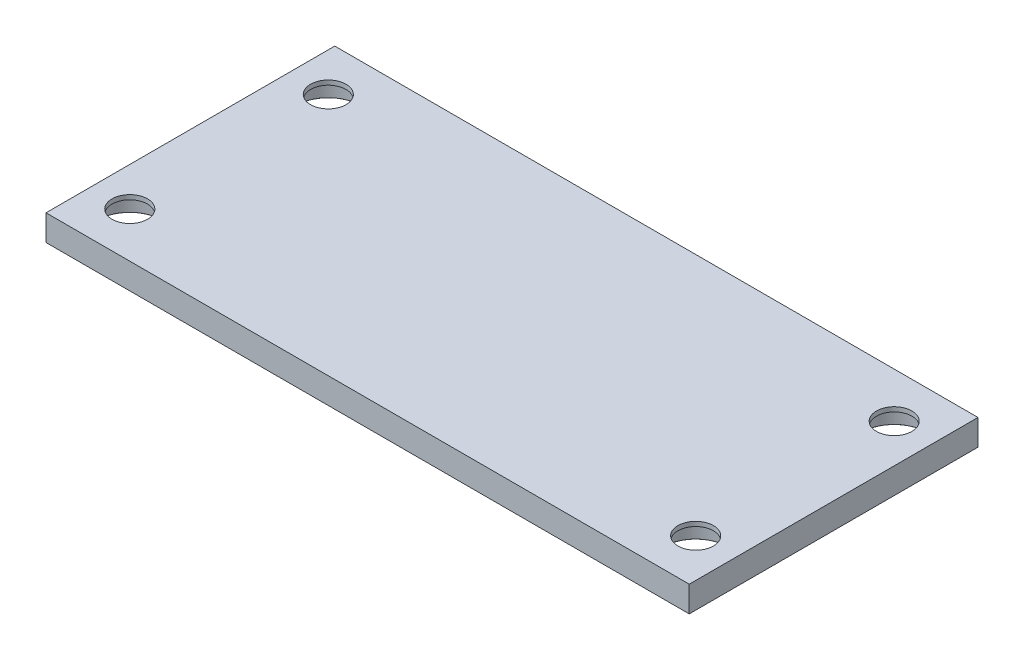
ISO-10303-21;
HEADER;
FILE_DESCRIPTION(('STEP AP214'),'2;1');
FILE_NAME('part.step','',(''),(''),'','','');
FILE_SCHEMA(('AUTOMOTIVE_DESIGN { 1 0 10303 214 1 1 1 1 }'));
ENDSEC;
DATA;
#1=APPLICATION_CONTEXT('core data for automotive mechanical design processes');
#2=APPLICATION_PROTOCOL_DEFINITION('international standard','automotive_design',2000,#1);
#3=PRODUCT_CONTEXT('',#1,'mechanical');
#4=PRODUCT('Part','Part','',(#3));
#5=PRODUCT_RELATED_PRODUCT_CATEGORY('part','',(#4));
#6=PRODUCT_DEFINITION_FORMATION('','',#4);
#7=PRODUCT_DEFINITION_CONTEXT('part definition',#1,'design');
#8=PRODUCT_DEFINITION('design','',#6,#7);
#9=PRODUCT_DEFINITION_SHAPE('','',#8);
#10=(LENGTH_UNIT() NAMED_UNIT(*) SI_UNIT(.MILLI.,.METRE.));
#11=(NAMED_UNIT(*) PLANE_ANGLE_UNIT() SI_UNIT($,.RADIAN.));
#12=(NAMED_UNIT(*) SI_UNIT($,.STERADIAN.) SOLID_ANGLE_UNIT());
#13=UNCERTAINTY_MEASURE_WITH_UNIT(LENGTH_MEASURE(1.E-05),#10,'distance_accuracy_value','');
#14=(GEOMETRIC_REPRESENTATION_CONTEXT(3) GLOBAL_UNCERTAINTY_ASSIGNED_CONTEXT((#13)) GLOBAL_UNIT_ASSIGNED_CONTEXT((#10,
#11,#12)) REPRESENTATION_CONTEXT('',''));
#15=CARTESIAN_POINT('',(0.,0.,0.));
#16=DIRECTION('',(0.,0.,1.));
#17=DIRECTION('',(1.,0.,0.));
#18=AXIS2_PLACEMENT_3D('',#15,#16,#17);
#19=CARTESIAN_POINT('',(-49.9,4.,-22.4));
#20=DIRECTION('',(1.,0.,0.));
#21=DIRECTION('',(0.,0.,-1.));
#22=AXIS2_PLACEMENT_3D('',#19,#20,#21);
#23=PLANE('',#22);
#24=DIRECTION('',(0.,0.,1.));
#25=VECTOR('',#24,1.);
#26=CARTESIAN_POINT('',(-49.9,0.,-22.4));
#27=LINE('',#26,#25);
#28=CARTESIAN_POINT('',(-49.9,0.,-22.4));
#29=VERTEX_POINT('',#28);
#30=CARTESIAN_POINT('',(-49.9,0.,22.4));
#31=VERTEX_POINT('',#30);
#32=EDGE_CURVE('E104',#29,#31,#27,.T.);
#33=ORIENTED_EDGE('',*,*,#32,.T.);
#34=DIRECTION('',(0.,-1.,0.));
#35=VECTOR('',#34,1.);
#36=CARTESIAN_POINT('',(-49.9,4.,22.4));
#37=LINE('',#36,#35);
#38=CARTESIAN_POINT('',(-49.9,4.,22.4));
#39=VERTEX_POINT('',#38);
#40=EDGE_CURVE('E11',#39,#31,#37,.T.);
#41=ORIENTED_EDGE('',*,*,#40,.F.);
#42=DIRECTION('',(0.,0.,1.));
#43=VECTOR('',#42,1.);
#44=CARTESIAN_POINT('',(-49.9,4.,-22.4));
#45=LINE('',#44,#43);
#46=CARTESIAN_POINT('',(-49.9,4.,-22.4));
#47=VERTEX_POINT('',#46);
#48=EDGE_CURVE('E91',#47,#39,#45,.T.);
#49=ORIENTED_EDGE('',*,*,#48,.F.);
#50=DIRECTION('',(0.,-1.,0.));
#51=VECTOR('',#50,1.);
#52=CARTESIAN_POINT('',(-49.9,4.,-22.4));
#53=LINE('',#52,#51);
#54=EDGE_CURVE('E100',#47,#29,#53,.T.);
#55=ORIENTED_EDGE('',*,*,#54,.T.);
#56=EDGE_LOOP('',(#33,#41,#49,#55));
#57=FACE_BOUND('',#56,.T.);
#58=ADVANCED_FACE('F38',(#57),#23,.F.);
#59=CARTESIAN_POINT('',(49.9,4.,22.4));
#60=DIRECTION('',(0.,0.,-1.));
#61=DIRECTION('',(-1.,0.,0.));
#62=AXIS2_PLACEMENT_3D('',#59,#60,#61);
#63=PLANE('',#62);
#64=DIRECTION('',(1.,0.,0.));
#65=VECTOR('',#64,1.);
#66=CARTESIAN_POINT('',(49.9,0.,22.4));
#67=LINE('',#66,#65);
#68=CARTESIAN_POINT('',(49.9,0.,22.4));
#69=VERTEX_POINT('',#68);
#70=EDGE_CURVE('E95',#31,#69,#67,.T.);
#71=ORIENTED_EDGE('',*,*,#70,.T.);
#72=DIRECTION('',(0.,-1.,0.));
#73=VECTOR('',#72,1.);
#74=CARTESIAN_POINT('',(49.9,4.,22.4));
#75=LINE('',#74,#73);
#76=CARTESIAN_POINT('',(49.9,4.,22.4));
#77=VERTEX_POINT('',#76);
#78=EDGE_CURVE('E47',#77,#69,#75,.T.);
#79=ORIENTED_EDGE('',*,*,#78,.F.);
#80=DIRECTION('',(1.,0.,0.));
#81=VECTOR('',#80,1.);
#82=CARTESIAN_POINT('',(49.9,4.,22.4));
#83=LINE('',#82,#81);
#84=EDGE_CURVE('E86',#39,#77,#83,.T.);
#85=ORIENTED_EDGE('',*,*,#84,.F.);
#86=ORIENTED_EDGE('',*,*,#40,.T.);
#87=EDGE_LOOP('',(#71,#79,#85,#86));
#88=FACE_BOUND('',#87,.T.);
#89=ADVANCED_FACE('F94',(#88),#63,.F.);
#90=CARTESIAN_POINT('',(49.9,4.,-22.4));
#91=DIRECTION('',(-1.,0.,0.));
#92=DIRECTION('',(0.,0.,1.));
#93=AXIS2_PLACEMENT_3D('',#90,#91,#92);
#94=PLANE('',#93);
#95=DIRECTION('',(0.,0.,-1.));
#96=VECTOR('',#95,1.);
#97=CARTESIAN_POINT('',(49.9,0.,-22.4));
#98=LINE('',#97,#96);
#99=CARTESIAN_POINT('',(49.9,0.,-22.4));
#100=VERTEX_POINT('',#99);
#101=EDGE_CURVE('E73',#69,#100,#98,.T.);
#102=ORIENTED_EDGE('',*,*,#101,.T.);
#103=DIRECTION('',(0.,-1.,0.));
#104=VECTOR('',#103,1.);
#105=CARTESIAN_POINT('',(49.9,4.,-22.4));
#106=LINE('',#105,#104);
#107=CARTESIAN_POINT('',(49.9,4.,-22.4));
#108=VERTEX_POINT('',#107);
#109=EDGE_CURVE('E96',#108,#100,#106,.T.);
#110=ORIENTED_EDGE('',*,*,#109,.F.);
#111=DIRECTION('',(0.,0.,-1.));
#112=VECTOR('',#111,1.);
#113=CARTESIAN_POINT('',(49.9,4.,-22.4));
#114=LINE('',#113,#112);
#115=EDGE_CURVE('E89',#77,#108,#114,.T.);
#116=ORIENTED_EDGE('',*,*,#115,.F.);
#117=ORIENTED_EDGE('',*,*,#78,.T.);
#118=EDGE_LOOP('',(#102,#110,#116,#117));
#119=FACE_BOUND('',#118,.T.);
#120=ADVANCED_FACE('F98',(#119),#94,.F.);
#121=CARTESIAN_POINT('',(49.9,4.,-22.4));
#122=DIRECTION('',(0.,0.,1.));
#123=DIRECTION('',(1.,0.,0.));
#124=AXIS2_PLACEMENT_3D('',#121,#122,#123);
#125=PLANE('',#124);
#126=DIRECTION('',(-1.,0.,0.));
#127=VECTOR('',#126,1.);
#128=CARTESIAN_POINT('',(49.9,0.,-22.4));
#129=LINE('',#128,#127);
#130=EDGE_CURVE('E79',#100,#29,#129,.T.);
#131=ORIENTED_EDGE('',*,*,#130,.T.);
#132=ORIENTED_EDGE('',*,*,#54,.F.);
#133=DIRECTION('',(-1.,0.,0.));
#134=VECTOR('',#133,1.);
#135=CARTESIAN_POINT('',(49.9,4.,-22.4));
#136=LINE('',#135,#134);
#137=EDGE_CURVE('E56',#108,#47,#136,.T.);
#138=ORIENTED_EDGE('',*,*,#137,.F.);
#139=ORIENTED_EDGE('',*,*,#109,.T.);
#140=EDGE_LOOP('',(#131,#132,#138,#139));
#141=FACE_BOUND('',#140,.T.);
#142=ADVANCED_FACE('F186',(#141),#125,.F.);
#143=CARTESIAN_POINT('',(0.,4.,0.));
#144=DIRECTION('',(0.,-1.,0.));
#145=DIRECTION('',(0.,0.,-1.));
#146=AXIS2_PLACEMENT_3D('',#143,#144,#145);
#147=PLANE('',#146);
#148=CARTESIAN_POINT('',(-43.9,4.,-15.4));
#149=DIRECTION('',(0.,-1.,0.));
#150=DIRECTION('',(0.,0.,-1.));
#151=AXIS2_PLACEMENT_3D('',#148,#149,#150);
#152=CIRCLE('',#151,2.75);
#153=CARTESIAN_POINT('',(-43.9,4.,-18.15));
#154=VERTEX_POINT('',#153);
#155=EDGE_CURVE('E41',#154,#154,#152,.T.);
#156=ORIENTED_EDGE('',*,*,#155,.T.);
#157=EDGE_LOOP('',(#156));
#158=FACE_BOUND('',#157,.T.);
#159=CARTESIAN_POINT('',(-43.9,4.,15.4));
#160=DIRECTION('',(0.,-1.,0.));
#161=DIRECTION('',(0.,0.,-1.));
#162=AXIS2_PLACEMENT_3D('',#159,#160,#161);
#163=CIRCLE('',#162,2.75);
#164=CARTESIAN_POINT('',(-43.9,4.,12.65));
#165=VERTEX_POINT('',#164);
#166=EDGE_CURVE('E120',#165,#165,#163,.T.);
#167=ORIENTED_EDGE('',*,*,#166,.T.);
#168=EDGE_LOOP('',(#167));
#169=FACE_BOUND('',#168,.T.);
#170=CARTESIAN_POINT('',(43.9,4.,15.4));
#171=DIRECTION('',(0.,-1.,0.));
#172=DIRECTION('',(0.,0.,-1.));
#173=AXIS2_PLACEMENT_3D('',#170,#171,#172);
#174=CIRCLE('',#173,2.75);
#175=CARTESIAN_POINT('',(43.9,4.,12.65));
#176=VERTEX_POINT('',#175);
#177=EDGE_CURVE('E116',#176,#176,#174,.T.);
#178=ORIENTED_EDGE('',*,*,#177,.T.);
#179=EDGE_LOOP('',(#178));
#180=FACE_BOUND('',#179,.T.);
#181=CARTESIAN_POINT('',(43.9,4.,-15.4));
#182=DIRECTION('',(0.,-1.,0.));
#183=DIRECTION('',(0.,0.,-1.));
#184=AXIS2_PLACEMENT_3D('',#181,#182,#183);
#185=CIRCLE('',#184,2.75);
#186=CARTESIAN_POINT('',(43.9,4.,-18.15));
#187=VERTEX_POINT('',#186);
#188=EDGE_CURVE('E107',#187,#187,#185,.T.);
#189=ORIENTED_EDGE('',*,*,#188,.T.);
#190=EDGE_LOOP('',(#189));
#191=FACE_BOUND('',#190,.T.);
#192=ORIENTED_EDGE('',*,*,#48,.T.);
#193=ORIENTED_EDGE('',*,*,#84,.T.);
#194=ORIENTED_EDGE('',*,*,#115,.T.);
#195=ORIENTED_EDGE('',*,*,#137,.T.);
#196=EDGE_LOOP('',(#192,#193,#194,#195));
#197=FACE_BOUND('',#196,.T.);
#198=ADVANCED_FACE('F87',(#158,#169,#180,#191,#197),#147,.F.);
#199=CARTESIAN_POINT('',(0.,0.,0.));
#200=DIRECTION('',(0.,-1.,0.));
#201=DIRECTION('',(0.,0.,-1.));
#202=AXIS2_PLACEMENT_3D('',#199,#200,#201);
#203=PLANE('',#202);
#204=CARTESIAN_POINT('',(-43.9,0.,-15.4));
#205=DIRECTION('',(0.,-1.,0.));
#206=DIRECTION('',(0.,0.,-1.));
#207=AXIS2_PLACEMENT_3D('',#204,#205,#206);
#208=CIRCLE('',#207,5.025);
#209=CARTESIAN_POINT('',(-43.9,0.,-20.425));
#210=VERTEX_POINT('',#209);
#211=EDGE_CURVE('E426',#210,#210,#208,.T.);
#212=ORIENTED_EDGE('',*,*,#211,.F.);
#213=EDGE_LOOP('',(#212));
#214=FACE_BOUND('',#213,.T.);
#215=CARTESIAN_POINT('',(-43.9,0.,15.4));
#216=DIRECTION('',(0.,-1.,0.));
#217=DIRECTION('',(0.,0.,-1.));
#218=AXIS2_PLACEMENT_3D('',#215,#216,#217);
#219=CIRCLE('',#218,5.025);
#220=CARTESIAN_POINT('',(-43.9,0.,10.375));
#221=VERTEX_POINT('',#220);
#222=EDGE_CURVE('E436',#221,#221,#219,.T.);
#223=ORIENTED_EDGE('',*,*,#222,.F.);
#224=EDGE_LOOP('',(#223));
#225=FACE_BOUND('',#224,.T.);
#226=CARTESIAN_POINT('',(43.9,0.,15.4));
#227=DIRECTION('',(0.,-1.,0.));
#228=DIRECTION('',(0.,0.,-1.));
#229=AXIS2_PLACEMENT_3D('',#226,#227,#228);
#230=CIRCLE('',#229,5.025);
#231=CARTESIAN_POINT('',(43.9,0.,10.375));
#232=VERTEX_POINT('',#231);
#233=EDGE_CURVE('E122',#232,#232,#230,.T.);
#234=ORIENTED_EDGE('',*,*,#233,.F.);
#235=EDGE_LOOP('',(#234));
#236=FACE_BOUND('',#235,.T.);
#237=CARTESIAN_POINT('',(43.9,0.,-15.4));
#238=DIRECTION('',(0.,-1.,0.));
#239=DIRECTION('',(0.,0.,-1.));
#240=AXIS2_PLACEMENT_3D('',#237,#238,#239);
#241=CIRCLE('',#240,5.025);
#242=CARTESIAN_POINT('',(43.9,0.,-20.425));
#243=VERTEX_POINT('',#242);
#244=EDGE_CURVE('E118',#243,#243,#241,.T.);
#245=ORIENTED_EDGE('',*,*,#244,.F.);
#246=EDGE_LOOP('',(#245));
#247=FACE_BOUND('',#246,.T.);
#248=ORIENTED_EDGE('',*,*,#32,.F.);
#249=ORIENTED_EDGE('',*,*,#130,.F.);
#250=ORIENTED_EDGE('',*,*,#101,.F.);
#251=ORIENTED_EDGE('',*,*,#70,.F.);
#252=EDGE_LOOP('',(#248,#249,#250,#251));
#253=FACE_BOUND('',#252,.T.);
#254=ADVANCED_FACE('F179',(#214,#225,#236,#247,#253),#203,.T.);
#255=CARTESIAN_POINT('',(43.9,0.,-15.4));
#256=DIRECTION('',(0.,-1.,0.));
#257=DIRECTION('',(0.,0.,-1.));
#258=AXIS2_PLACEMENT_3D('',#255,#256,#257);
#259=CYLINDRICAL_SURFACE('',#258,2.75);
#260=CARTESIAN_POINT('',(43.9,3.3,-15.4));
#261=DIRECTION('',(0.,-1.,0.));
#262=DIRECTION('',(0.,0.,-1.));
#263=AXIS2_PLACEMENT_3D('',#260,#261,#262);
#264=CIRCLE('',#263,2.75);
#265=CARTESIAN_POINT('',(43.9,3.3,-18.15));
#266=VERTEX_POINT('',#265);
#267=EDGE_CURVE('E115',#266,#266,#264,.T.);
#268=ORIENTED_EDGE('',*,*,#267,.T.);
#269=EDGE_LOOP('',(#268));
#270=FACE_BOUND('',#269,.T.);
#271=ORIENTED_EDGE('',*,*,#188,.F.);
#272=EDGE_LOOP('',(#271));
#273=FACE_BOUND('',#272,.T.);
#274=ADVANCED_FACE('F157',(#270,#273),#259,.F.);
#275=CARTESIAN_POINT('',(46.65,3.3,-15.4));
#276=DIRECTION('',(0.,1.,0.));
#277=DIRECTION('',(0.,0.,1.));
#278=AXIS2_PLACEMENT_3D('',#275,#276,#277);
#279=PLANE('',#278);
#280=ORIENTED_EDGE('',*,*,#267,.F.);
#281=EDGE_LOOP('',(#280));
#282=FACE_BOUND('',#281,.T.);
#283=CARTESIAN_POINT('',(43.9,3.3,-15.4));
#284=DIRECTION('',(0.,-1.,0.));
#285=DIRECTION('',(0.,0.,-1.));
#286=AXIS2_PLACEMENT_3D('',#283,#284,#285);
#287=CIRCLE('',#286,5.);
#288=CARTESIAN_POINT('',(43.9,3.3,-20.4));
#289=VERTEX_POINT('',#288);
#290=EDGE_CURVE('E151',#289,#289,#287,.T.);
#291=ORIENTED_EDGE('',*,*,#290,.T.);
#292=EDGE_LOOP('',(#291));
#293=FACE_BOUND('',#292,.T.);
#294=ADVANCED_FACE('F160',(#282,#293),#279,.F.);
#295=CARTESIAN_POINT('',(43.9,0.,-15.4));
#296=DIRECTION('',(0.,-1.,0.));
#297=DIRECTION('',(0.,0.,-1.));
#298=AXIS2_PLACEMENT_3D('',#295,#296,#297);
#299=CYLINDRICAL_SURFACE('',#298,5.);
#300=ORIENTED_EDGE('',*,*,#290,.F.);
#301=EDGE_LOOP('',(#300));
#302=FACE_BOUND('',#301,.T.);
#303=CARTESIAN_POINT('',(43.9,0.0249999999999992,-15.4));
#304=DIRECTION('',(0.,-1.,0.));
#305=DIRECTION('',(0.,0.,-1.));
#306=AXIS2_PLACEMENT_3D('',#303,#304,#305);
#307=CIRCLE('',#306,5.);
#308=CARTESIAN_POINT('',(43.9,0.0249999999999992,-20.4));
#309=VERTEX_POINT('',#308);
#310=EDGE_CURVE('E148',#309,#309,#307,.T.);
#311=ORIENTED_EDGE('',*,*,#310,.T.);
#312=EDGE_LOOP('',(#311));
#313=FACE_BOUND('',#312,.T.);
#314=ADVANCED_FACE('F163',(#302,#313),#299,.F.);
#315=CARTESIAN_POINT('',(43.9,0.,-15.4));
#316=DIRECTION('',(0.,-1.,0.));
#317=DIRECTION('',(0.,0.,-1.));
#318=AXIS2_PLACEMENT_3D('',#315,#316,#317);
#319=CONICAL_SURFACE('',#318,5.025,0.785398163397409);
#320=ORIENTED_EDGE('',*,*,#310,.F.);
#321=EDGE_LOOP('',(#320));
#322=FACE_BOUND('',#321,.T.);
#323=ORIENTED_EDGE('',*,*,#244,.T.);
#324=EDGE_LOOP('',(#323));
#325=FACE_BOUND('',#324,.T.);
#326=ADVANCED_FACE('F169',(#322,#325),#319,.F.);
#327=CARTESIAN_POINT('',(43.9,0.,15.4));
#328=DIRECTION('',(0.,-1.,0.));
#329=DIRECTION('',(0.,0.,-1.));
#330=AXIS2_PLACEMENT_3D('',#327,#328,#329);
#331=CYLINDRICAL_SURFACE('',#330,2.75);
#332=CARTESIAN_POINT('',(43.9,3.3,15.4));
#333=DIRECTION('',(0.,-1.,0.));
#334=DIRECTION('',(0.,0.,-1.));
#335=AXIS2_PLACEMENT_3D('',#332,#333,#334);
#336=CIRCLE('',#335,2.75);
#337=CARTESIAN_POINT('',(43.9,3.3,12.65));
#338=VERTEX_POINT('',#337);
#339=EDGE_CURVE('E119',#338,#338,#336,.T.);
#340=ORIENTED_EDGE('',*,*,#339,.T.);
#341=EDGE_LOOP('',(#340));
#342=FACE_BOUND('',#341,.T.);
#343=ORIENTED_EDGE('',*,*,#177,.F.);
#344=EDGE_LOOP('',(#343));
#345=FACE_BOUND('',#344,.T.);
#346=ADVANCED_FACE('F175',(#342,#345),#331,.F.);
#347=CARTESIAN_POINT('',(46.65,3.3,15.4));
#348=DIRECTION('',(0.,1.,0.));
#349=DIRECTION('',(0.,0.,1.));
#350=AXIS2_PLACEMENT_3D('',#347,#348,#349);
#351=PLANE('',#350);
#352=ORIENTED_EDGE('',*,*,#339,.F.);
#353=EDGE_LOOP('',(#352));
#354=FACE_BOUND('',#353,.T.);
#355=CARTESIAN_POINT('',(43.9,3.3,15.4));
#356=DIRECTION('',(0.,-1.,0.));
#357=DIRECTION('',(0.,0.,-1.));
#358=AXIS2_PLACEMENT_3D('',#355,#356,#357);
#359=CIRCLE('',#358,5.);
#360=CARTESIAN_POINT('',(43.9,3.3,10.4));
#361=VERTEX_POINT('',#360);
#362=EDGE_CURVE('E141',#361,#361,#359,.T.);
#363=ORIENTED_EDGE('',*,*,#362,.T.);
#364=EDGE_LOOP('',(#363));
#365=FACE_BOUND('',#364,.T.);
#366=ADVANCED_FACE('F259',(#354,#365),#351,.F.);
#367=CARTESIAN_POINT('',(43.9,0.,15.4));
#368=DIRECTION('',(0.,-1.,0.));
#369=DIRECTION('',(0.,0.,-1.));
#370=AXIS2_PLACEMENT_3D('',#367,#368,#369);
#371=CYLINDRICAL_SURFACE('',#370,5.);
#372=ORIENTED_EDGE('',*,*,#362,.F.);
#373=EDGE_LOOP('',(#372));
#374=FACE_BOUND('',#373,.T.);
#375=CARTESIAN_POINT('',(43.9,0.0249999999999992,15.4));
#376=DIRECTION('',(0.,-1.,0.));
#377=DIRECTION('',(0.,0.,-1.));
#378=AXIS2_PLACEMENT_3D('',#375,#376,#377);
#379=CIRCLE('',#378,5.);
#380=CARTESIAN_POINT('',(43.9,0.0249999999999992,10.4));
#381=VERTEX_POINT('',#380);
#382=EDGE_CURVE('E127',#381,#381,#379,.T.);
#383=ORIENTED_EDGE('',*,*,#382,.T.);
#384=EDGE_LOOP('',(#383));
#385=FACE_BOUND('',#384,.T.);
#386=ADVANCED_FACE('F270',(#374,#385),#371,.F.);
#387=CARTESIAN_POINT('',(43.9,0.,15.4));
#388=DIRECTION('',(0.,-1.,0.));
#389=DIRECTION('',(0.,0.,-1.));
#390=AXIS2_PLACEMENT_3D('',#387,#388,#389);
#391=CONICAL_SURFACE('',#390,5.025,0.785398163397409);
#392=ORIENTED_EDGE('',*,*,#382,.F.);
#393=EDGE_LOOP('',(#392));
#394=FACE_BOUND('',#393,.T.);
#395=ORIENTED_EDGE('',*,*,#233,.T.);
#396=EDGE_LOOP('',(#395));
#397=FACE_BOUND('',#396,.T.);
#398=ADVANCED_FACE('F281',(#394,#397),#391,.F.);
#399=CARTESIAN_POINT('',(-43.9,0.,15.4));
#400=DIRECTION('',(0.,-1.,0.));
#401=DIRECTION('',(0.,0.,-1.));
#402=AXIS2_PLACEMENT_3D('',#399,#400,#401);
#403=CYLINDRICAL_SURFACE('',#402,2.75);
#404=CARTESIAN_POINT('',(-43.9,3.3,15.4));
#405=DIRECTION('',(0.,-1.,0.));
#406=DIRECTION('',(0.,0.,-1.));
#407=AXIS2_PLACEMENT_3D('',#404,#405,#406);
#408=CIRCLE('',#407,2.75);
#409=CARTESIAN_POINT('',(-43.9,3.3,12.65));
#410=VERTEX_POINT('',#409);
#411=EDGE_CURVE('E123',#410,#410,#408,.T.);
#412=ORIENTED_EDGE('',*,*,#411,.T.);
#413=EDGE_LOOP('',(#412));
#414=FACE_BOUND('',#413,.T.);
#415=ORIENTED_EDGE('',*,*,#166,.F.);
#416=EDGE_LOOP('',(#415));
#417=FACE_BOUND('',#416,.T.);
#418=ADVANCED_FACE('F292',(#414,#417),#403,.F.);
#419=CARTESIAN_POINT('',(-41.15,3.3,15.4));
#420=DIRECTION('',(0.,1.,0.));
#421=DIRECTION('',(0.,0.,1.));
#422=AXIS2_PLACEMENT_3D('',#419,#420,#421);
#423=PLANE('',#422);
#424=ORIENTED_EDGE('',*,*,#411,.F.);
#425=EDGE_LOOP('',(#424));
#426=FACE_BOUND('',#425,.T.);
#427=CARTESIAN_POINT('',(-43.9,3.3,15.4));
#428=DIRECTION('',(0.,-1.,0.));
#429=DIRECTION('',(0.,0.,-1.));
#430=AXIS2_PLACEMENT_3D('',#427,#428,#429);
#431=CIRCLE('',#430,5.);
#432=CARTESIAN_POINT('',(-43.9,3.3,10.4));
#433=VERTEX_POINT('',#432);
#434=EDGE_CURVE('E130',#433,#433,#431,.T.);
#435=ORIENTED_EDGE('',*,*,#434,.T.);
#436=EDGE_LOOP('',(#435));
#437=FACE_BOUND('',#436,.T.);
#438=ADVANCED_FACE('F303',(#426,#437),#423,.F.);
#439=CARTESIAN_POINT('',(-43.9,0.,15.4));
#440=DIRECTION('',(0.,-1.,0.));
#441=DIRECTION('',(0.,0.,-1.));
#442=AXIS2_PLACEMENT_3D('',#439,#440,#441);
#443=CYLINDRICAL_SURFACE('',#442,5.);
#444=ORIENTED_EDGE('',*,*,#434,.F.);
#445=EDGE_LOOP('',(#444));
#446=FACE_BOUND('',#445,.T.);
#447=CARTESIAN_POINT('',(-43.9,0.0249999999999992,15.4));
#448=DIRECTION('',(0.,-1.,0.));
#449=DIRECTION('',(0.,0.,-1.));
#450=AXIS2_PLACEMENT_3D('',#447,#448,#449);
#451=CIRCLE('',#450,5.);
#452=CARTESIAN_POINT('',(-43.9,0.0249999999999992,10.4));
#453=VERTEX_POINT('',#452);
#454=EDGE_CURVE('E135',#453,#453,#451,.T.);
#455=ORIENTED_EDGE('',*,*,#454,.T.);
#456=EDGE_LOOP('',(#455));
#457=FACE_BOUND('',#456,.T.);
#458=ADVANCED_FACE('F313',(#446,#457),#443,.F.);
#459=CARTESIAN_POINT('',(-43.9,0.,15.4));
#460=DIRECTION('',(0.,-1.,0.));
#461=DIRECTION('',(0.,0.,-1.));
#462=AXIS2_PLACEMENT_3D('',#459,#460,#461);
#463=CONICAL_SURFACE('',#462,5.025,0.785398163397409);
#464=ORIENTED_EDGE('',*,*,#454,.F.);
#465=EDGE_LOOP('',(#464));
#466=FACE_BOUND('',#465,.T.);
#467=ORIENTED_EDGE('',*,*,#222,.T.);
#468=EDGE_LOOP('',(#467));
#469=FACE_BOUND('',#468,.T.);
#470=ADVANCED_FACE('F324',(#466,#469),#463,.F.);
#471=CARTESIAN_POINT('',(-43.9,0.,-15.4));
#472=DIRECTION('',(0.,-1.,0.));
#473=DIRECTION('',(0.,0.,-1.));
#474=AXIS2_PLACEMENT_3D('',#471,#472,#473);
#475=CYLINDRICAL_SURFACE('',#474,2.75);
#476=CARTESIAN_POINT('',(-43.9,3.3,-15.4));
#477=DIRECTION('',(0.,-1.,0.));
#478=DIRECTION('',(0.,0.,-1.));
#479=AXIS2_PLACEMENT_3D('',#476,#477,#478);
#480=CIRCLE('',#479,2.75);
#481=CARTESIAN_POINT('',(-43.9,3.3,-18.15));
#482=VERTEX_POINT('',#481);
#483=EDGE_CURVE('E433',#482,#482,#480,.T.);
#484=ORIENTED_EDGE('',*,*,#483,.T.);
#485=EDGE_LOOP('',(#484));
#486=FACE_BOUND('',#485,.T.);
#487=ORIENTED_EDGE('',*,*,#155,.F.);
#488=EDGE_LOOP('',(#487));
#489=FACE_BOUND('',#488,.T.);
#490=ADVANCED_FACE('F335',(#486,#489),#475,.F.);
#491=CARTESIAN_POINT('',(-41.15,3.3,-15.4));
#492=DIRECTION('',(0.,1.,0.));
#493=DIRECTION('',(0.,0.,1.));
#494=AXIS2_PLACEMENT_3D('',#491,#492,#493);
#495=PLANE('',#494);
#496=ORIENTED_EDGE('',*,*,#483,.F.);
#497=EDGE_LOOP('',(#496));
#498=FACE_BOUND('',#497,.T.);
#499=CARTESIAN_POINT('',(-43.9,3.3,-15.4));
#500=DIRECTION('',(0.,-1.,0.));
#501=DIRECTION('',(0.,0.,-1.));
#502=AXIS2_PLACEMENT_3D('',#499,#500,#501);
#503=CIRCLE('',#502,5.);
#504=CARTESIAN_POINT('',(-43.9,3.3,-20.4));
#505=VERTEX_POINT('',#504);
#506=EDGE_CURVE('E428',#505,#505,#503,.T.);
#507=ORIENTED_EDGE('',*,*,#506,.T.);
#508=EDGE_LOOP('',(#507));
#509=FACE_BOUND('',#508,.T.);
#510=ADVANCED_FACE('F346',(#498,#509),#495,.F.);
#511=CARTESIAN_POINT('',(-43.9,0.,-15.4));
#512=DIRECTION('',(0.,-1.,0.));
#513=DIRECTION('',(0.,0.,-1.));
#514=AXIS2_PLACEMENT_3D('',#511,#512,#513);
#515=CYLINDRICAL_SURFACE('',#514,5.);
#516=ORIENTED_EDGE('',*,*,#506,.F.);
#517=EDGE_LOOP('',(#516));
#518=FACE_BOUND('',#517,.T.);
#519=CARTESIAN_POINT('',(-43.9,0.0249999999999992,-15.4));
#520=DIRECTION('',(0.,-1.,0.));
#521=DIRECTION('',(0.,0.,-1.));
#522=AXIS2_PLACEMENT_3D('',#519,#520,#521);
#523=CIRCLE('',#522,5.);
#524=CARTESIAN_POINT('',(-43.9,0.0249999999999992,-20.4));
#525=VERTEX_POINT('',#524);
#526=EDGE_CURVE('E423',#525,#525,#523,.T.);
#527=ORIENTED_EDGE('',*,*,#526,.T.);
#528=EDGE_LOOP('',(#527));
#529=FACE_BOUND('',#528,.T.);
#530=ADVANCED_FACE('F357',(#518,#529),#515,.F.);
#531=CARTESIAN_POINT('',(-43.9,0.,-15.4));
#532=DIRECTION('',(0.,-1.,0.));
#533=DIRECTION('',(0.,0.,-1.));
#534=AXIS2_PLACEMENT_3D('',#531,#532,#533);
#535=CONICAL_SURFACE('',#534,5.025,0.785398163397409);
#536=ORIENTED_EDGE('',*,*,#526,.F.);
#537=EDGE_LOOP('',(#536));
#538=FACE_BOUND('',#537,.T.);
#539=ORIENTED_EDGE('',*,*,#211,.T.);
#540=EDGE_LOOP('',(#539));
#541=FACE_BOUND('',#540,.T.);
#542=ADVANCED_FACE('F368',(#538,#541),#535,.F.);
#543=CLOSED_SHELL('',(#58,#89,#120,#142,#198,#254,#274,#294,#314,#326,#346,#366,#386,#398,#418,
#438,#458,#470,#490,#510,#530,#542));
#544=MANIFOLD_SOLID_BREP('B2',#543);
#545=ADVANCED_BREP_SHAPE_REPRESENTATION('',(#18,#544),#14);
#546=SHAPE_DEFINITION_REPRESENTATION(#9,#545);
ENDSEC;
END-ISO-10303-21;
